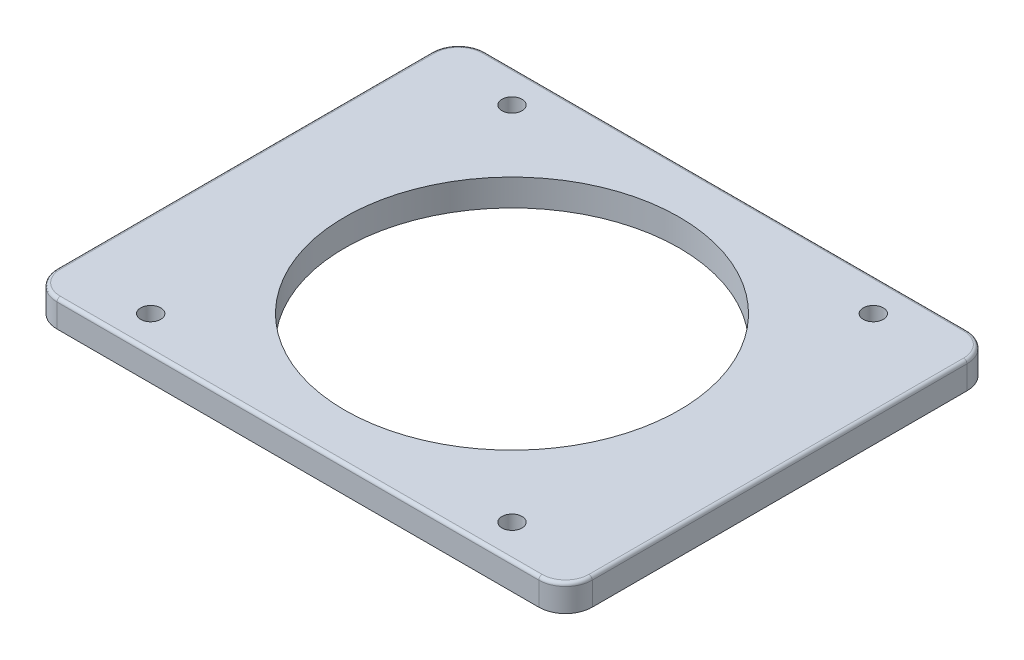
ISO-10303-21;
HEADER;
FILE_DESCRIPTION(('STEP AP214'),'2;1');
FILE_NAME('part.step','',(''),(''),'','','');
FILE_SCHEMA(('AUTOMOTIVE_DESIGN { 1 0 10303 214 1 1 1 1 }'));
ENDSEC;
DATA;
#1=APPLICATION_CONTEXT('core data for automotive mechanical design processes');
#2=APPLICATION_PROTOCOL_DEFINITION('international standard','automotive_design',2000,#1);
#3=PRODUCT_CONTEXT('',#1,'mechanical');
#4=PRODUCT('Part','Part','',(#3));
#5=PRODUCT_RELATED_PRODUCT_CATEGORY('part','',(#4));
#6=PRODUCT_DEFINITION_FORMATION('','',#4);
#7=PRODUCT_DEFINITION_CONTEXT('part definition',#1,'design');
#8=PRODUCT_DEFINITION('design','',#6,#7);
#9=PRODUCT_DEFINITION_SHAPE('','',#8);
#10=(LENGTH_UNIT() NAMED_UNIT(*) SI_UNIT(.MILLI.,.METRE.));
#11=(NAMED_UNIT(*) PLANE_ANGLE_UNIT() SI_UNIT($,.RADIAN.));
#12=(NAMED_UNIT(*) SI_UNIT($,.STERADIAN.) SOLID_ANGLE_UNIT());
#13=UNCERTAINTY_MEASURE_WITH_UNIT(LENGTH_MEASURE(1.E-05),#10,'distance_accuracy_value','');
#14=(GEOMETRIC_REPRESENTATION_CONTEXT(3) GLOBAL_UNCERTAINTY_ASSIGNED_CONTEXT((#13)) GLOBAL_UNIT_ASSIGNED_CONTEXT((#10,
#11,#12)) REPRESENTATION_CONTEXT('',''));
#15=CARTESIAN_POINT('',(0.,0.,0.));
#16=DIRECTION('',(0.,0.,1.));
#17=DIRECTION('',(1.,0.,0.));
#18=AXIS2_PLACEMENT_3D('',#15,#16,#17);
#19=CARTESIAN_POINT('',(0.,2.,0.));
#20=DIRECTION('',(0.,-1.,0.));
#21=DIRECTION('',(0.,0.,-1.));
#22=AXIS2_PLACEMENT_3D('',#19,#20,#21);
#23=PLANE('',#22);
#24=CARTESIAN_POINT('',(0.,2.,0.));
#25=DIRECTION('',(0.,1.,0.));
#26=DIRECTION('',(0.,0.,1.));
#27=AXIS2_PLACEMENT_3D('',#24,#25,#26);
#28=CIRCLE('',#27,12.5);
#29=CARTESIAN_POINT('',(0.,2.,12.5));
#30=VERTEX_POINT('',#29);
#31=EDGE_CURVE('E359',#30,#30,#28,.T.);
#32=ORIENTED_EDGE('',*,*,#31,.F.);
#33=EDGE_LOOP('',(#32));
#34=FACE_BOUND('',#33,.T.);
#35=CARTESIAN_POINT('',(-13.5,2.,-13.5));
#36=DIRECTION('',(0.,1.,0.));
#37=DIRECTION('',(0.,0.,1.));
#38=AXIS2_PLACEMENT_3D('',#35,#36,#37);
#39=CIRCLE('',#38,0.75);
#40=CARTESIAN_POINT('',(-13.5,2.,-12.75));
#41=VERTEX_POINT('',#40);
#42=EDGE_CURVE('E367',#41,#41,#39,.T.);
#43=ORIENTED_EDGE('',*,*,#42,.F.);
#44=EDGE_LOOP('',(#43));
#45=FACE_BOUND('',#44,.T.);
#46=CARTESIAN_POINT('',(13.5,2.,-13.5000000000008));
#47=DIRECTION('',(0.,1.,0.));
#48=DIRECTION('',(0.,0.,1.));
#49=AXIS2_PLACEMENT_3D('',#46,#47,#48);
#50=CIRCLE('',#49,0.750000000000775);
#51=CARTESIAN_POINT('',(13.5,2.,-12.75));
#52=VERTEX_POINT('',#51);
#53=EDGE_CURVE('E373',#52,#52,#50,.T.);
#54=ORIENTED_EDGE('',*,*,#53,.F.);
#55=EDGE_LOOP('',(#54));
#56=FACE_BOUND('',#55,.T.);
#57=CARTESIAN_POINT('',(13.5000000000007,2.,13.4999999999992));
#58=DIRECTION('',(0.,1.,0.));
#59=DIRECTION('',(0.,0.,1.));
#60=AXIS2_PLACEMENT_3D('',#57,#58,#59);
#61=CIRCLE('',#60,0.75000000000105);
#62=CARTESIAN_POINT('',(13.5000000000007,2.,14.2500000000003));
#63=VERTEX_POINT('',#62);
#64=EDGE_CURVE('E381',#63,#63,#61,.T.);
#65=ORIENTED_EDGE('',*,*,#64,.F.);
#66=EDGE_LOOP('',(#65));
#67=FACE_BOUND('',#66,.T.);
#68=CARTESIAN_POINT('',(-13.4999999999992,2.,13.5));
#69=DIRECTION('',(0.,1.,0.));
#70=DIRECTION('',(0.,0.,1.));
#71=AXIS2_PLACEMENT_3D('',#68,#69,#70);
#72=CIRCLE('',#71,0.750000000000388);
#73=CARTESIAN_POINT('',(-13.4999999999992,2.,14.2500000000004));
#74=VERTEX_POINT('',#73);
#75=EDGE_CURVE('E389',#74,#74,#72,.T.);
#76=ORIENTED_EDGE('',*,*,#75,.F.);
#77=EDGE_LOOP('',(#76));
#78=FACE_BOUND('',#77,.T.);
#79=CARTESIAN_POINT('',(18.,2.,14.));
#80=DIRECTION('',(0.,-1.,0.));
#81=DIRECTION('',(0.,0.,-1.));
#82=AXIS2_PLACEMENT_3D('',#79,#80,#81);
#83=CIRCLE('',#82,1.75);
#84=CARTESIAN_POINT('',(19.75,2.,14.));
#85=VERTEX_POINT('',#84);
#86=CARTESIAN_POINT('',(18.,2.,15.75));
#87=VERTEX_POINT('',#86);
#88=EDGE_CURVE('E176',#85,#87,#83,.T.);
#89=ORIENTED_EDGE('',*,*,#88,.F.);
#90=DIRECTION('',(0.,0.,-1.));
#91=VECTOR('',#90,1.);
#92=CARTESIAN_POINT('',(19.75,2.,0.));
#93=LINE('',#92,#91);
#94=CARTESIAN_POINT('',(19.75,2.,-14.));
#95=VERTEX_POINT('',#94);
#96=EDGE_CURVE('E288',#85,#95,#93,.T.);
#97=ORIENTED_EDGE('',*,*,#96,.T.);
#98=CARTESIAN_POINT('',(18.,2.,-14.));
#99=DIRECTION('',(0.,-1.,0.));
#100=DIRECTION('',(0.,0.,-1.));
#101=AXIS2_PLACEMENT_3D('',#98,#99,#100);
#102=CIRCLE('',#101,1.75);
#103=CARTESIAN_POINT('',(18.,2.,-15.75));
#104=VERTEX_POINT('',#103);
#105=EDGE_CURVE('E189',#104,#95,#102,.T.);
#106=ORIENTED_EDGE('',*,*,#105,.F.);
#107=DIRECTION('',(-1.,0.,0.));
#108=VECTOR('',#107,1.);
#109=CARTESIAN_POINT('',(0.,2.,-15.75));
#110=LINE('',#109,#108);
#111=CARTESIAN_POINT('',(-18.,2.,-15.75));
#112=VERTEX_POINT('',#111);
#113=EDGE_CURVE('E284',#104,#112,#110,.T.);
#114=ORIENTED_EDGE('',*,*,#113,.T.);
#115=CARTESIAN_POINT('',(-18.,2.,-14.));
#116=DIRECTION('',(0.,-1.,0.));
#117=DIRECTION('',(0.,0.,-1.));
#118=AXIS2_PLACEMENT_3D('',#115,#116,#117);
#119=CIRCLE('',#118,1.75);
#120=CARTESIAN_POINT('',(-19.75,2.,-14.));
#121=VERTEX_POINT('',#120);
#122=EDGE_CURVE('E178',#121,#112,#119,.T.);
#123=ORIENTED_EDGE('',*,*,#122,.F.);
#124=DIRECTION('',(0.,0.,1.));
#125=VECTOR('',#124,1.);
#126=CARTESIAN_POINT('',(-19.75,2.,0.));
#127=LINE('',#126,#125);
#128=CARTESIAN_POINT('',(-19.75,2.,14.));
#129=VERTEX_POINT('',#128);
#130=EDGE_CURVE('E280',#121,#129,#127,.T.);
#131=ORIENTED_EDGE('',*,*,#130,.T.);
#132=CARTESIAN_POINT('',(-18.,2.,14.));
#133=DIRECTION('',(0.,-1.,0.));
#134=DIRECTION('',(0.,0.,-1.));
#135=AXIS2_PLACEMENT_3D('',#132,#133,#134);
#136=CIRCLE('',#135,1.75);
#137=CARTESIAN_POINT('',(-18.,2.,15.75));
#138=VERTEX_POINT('',#137);
#139=EDGE_CURVE('E183',#138,#129,#136,.T.);
#140=ORIENTED_EDGE('',*,*,#139,.F.);
#141=DIRECTION('',(1.,0.,0.));
#142=VECTOR('',#141,1.);
#143=CARTESIAN_POINT('',(0.,2.,15.75));
#144=LINE('',#143,#142);
#145=EDGE_CURVE('E272',#138,#87,#144,.T.);
#146=ORIENTED_EDGE('',*,*,#145,.T.);
#147=EDGE_LOOP('',(#89,#97,#106,#114,#123,#131,#140,#146));
#148=FACE_BOUND('',#147,.T.);
#149=ADVANCED_FACE('F45',(#34,#45,#56,#67,#78,#148),#23,.F.);
#150=CARTESIAN_POINT('',(0.,0.,0.));
#151=DIRECTION('',(0.,-1.,0.));
#152=DIRECTION('',(0.,0.,-1.));
#153=AXIS2_PLACEMENT_3D('',#150,#151,#152);
#154=PLANE('',#153);
#155=CARTESIAN_POINT('',(13.5000000000007,0.,13.4999999999992));
#156=DIRECTION('',(0.,1.,0.));
#157=DIRECTION('',(0.,0.,1.));
#158=AXIS2_PLACEMENT_3D('',#155,#156,#157);
#159=CIRCLE('',#158,0.75000000000105);
#160=CARTESIAN_POINT('',(13.5000000000007,0.,14.2500000000003));
#161=VERTEX_POINT('',#160);
#162=EDGE_CURVE('E385',#161,#161,#159,.T.);
#163=ORIENTED_EDGE('',*,*,#162,.T.);
#164=EDGE_LOOP('',(#163));
#165=FACE_BOUND('',#164,.T.);
#166=CARTESIAN_POINT('',(-13.5,0.,-13.5));
#167=DIRECTION('',(0.,1.,0.));
#168=DIRECTION('',(0.,0.,1.));
#169=AXIS2_PLACEMENT_3D('',#166,#167,#168);
#170=CIRCLE('',#169,0.75);
#171=CARTESIAN_POINT('',(-13.5,0.,-12.75));
#172=VERTEX_POINT('',#171);
#173=EDGE_CURVE('E369',#172,#172,#170,.T.);
#174=ORIENTED_EDGE('',*,*,#173,.T.);
#175=EDGE_LOOP('',(#174));
#176=FACE_BOUND('',#175,.T.);
#177=DIRECTION('',(0.,0.,1.));
#178=VECTOR('',#177,1.);
#179=CARTESIAN_POINT('',(-20.,0.,16.));
#180=LINE('',#179,#178);
#181=CARTESIAN_POINT('',(-20.,0.,-14.));
#182=VERTEX_POINT('',#181);
#183=CARTESIAN_POINT('',(-20.,0.,14.));
#184=VERTEX_POINT('',#183);
#185=EDGE_CURVE('E261',#182,#184,#180,.T.);
#186=ORIENTED_EDGE('',*,*,#185,.F.);
#187=CARTESIAN_POINT('',(-18.,0.,-14.));
#188=DIRECTION('',(0.,-1.,0.));
#189=DIRECTION('',(0.,0.,-1.));
#190=AXIS2_PLACEMENT_3D('',#187,#188,#189);
#191=CIRCLE('',#190,2.);
#192=CARTESIAN_POINT('',(-18.,0.,-16.));
#193=VERTEX_POINT('',#192);
#194=EDGE_CURVE('E63',#182,#193,#191,.T.);
#195=ORIENTED_EDGE('',*,*,#194,.T.);
#196=DIRECTION('',(-1.,0.,0.));
#197=VECTOR('',#196,1.);
#198=CARTESIAN_POINT('',(-20.,0.,-16.));
#199=LINE('',#198,#197);
#200=CARTESIAN_POINT('',(18.,0.,-16.));
#201=VERTEX_POINT('',#200);
#202=EDGE_CURVE('E268',#201,#193,#199,.T.);
#203=ORIENTED_EDGE('',*,*,#202,.F.);
#204=CARTESIAN_POINT('',(18.,0.,-14.));
#205=DIRECTION('',(0.,-1.,0.));
#206=DIRECTION('',(0.,0.,-1.));
#207=AXIS2_PLACEMENT_3D('',#204,#205,#206);
#208=CIRCLE('',#207,2.);
#209=CARTESIAN_POINT('',(20.,0.,-14.));
#210=VERTEX_POINT('',#209);
#211=EDGE_CURVE('E223',#201,#210,#208,.T.);
#212=ORIENTED_EDGE('',*,*,#211,.T.);
#213=DIRECTION('',(0.,0.,-1.));
#214=VECTOR('',#213,1.);
#215=CARTESIAN_POINT('',(20.,0.,16.));
#216=LINE('',#215,#214);
#217=CARTESIAN_POINT('',(20.,0.,14.));
#218=VERTEX_POINT('',#217);
#219=EDGE_CURVE('E274',#218,#210,#216,.T.);
#220=ORIENTED_EDGE('',*,*,#219,.F.);
#221=CARTESIAN_POINT('',(18.,0.,14.));
#222=DIRECTION('',(0.,-1.,0.));
#223=DIRECTION('',(0.,0.,-1.));
#224=AXIS2_PLACEMENT_3D('',#221,#222,#223);
#225=CIRCLE('',#224,2.);
#226=CARTESIAN_POINT('',(18.,0.,16.));
#227=VERTEX_POINT('',#226);
#228=EDGE_CURVE('E220',#218,#227,#225,.T.);
#229=ORIENTED_EDGE('',*,*,#228,.T.);
#230=DIRECTION('',(1.,0.,0.));
#231=VECTOR('',#230,1.);
#232=CARTESIAN_POINT('',(-20.,0.,16.));
#233=LINE('',#232,#231);
#234=CARTESIAN_POINT('',(-18.,0.,16.));
#235=VERTEX_POINT('',#234);
#236=EDGE_CURVE('E145',#235,#227,#233,.T.);
#237=ORIENTED_EDGE('',*,*,#236,.F.);
#238=CARTESIAN_POINT('',(-18.,0.,14.));
#239=DIRECTION('',(0.,-1.,0.));
#240=DIRECTION('',(0.,0.,-1.));
#241=AXIS2_PLACEMENT_3D('',#238,#239,#240);
#242=CIRCLE('',#241,2.);
#243=EDGE_CURVE('E226',#235,#184,#242,.T.);
#244=ORIENTED_EDGE('',*,*,#243,.T.);
#245=EDGE_LOOP('',(#186,#195,#203,#212,#220,#229,#237,#244));
#246=FACE_BOUND('',#245,.T.);
#247=CARTESIAN_POINT('',(0.,0.,0.));
#248=DIRECTION('',(0.,1.,0.));
#249=DIRECTION('',(0.,0.,1.));
#250=AXIS2_PLACEMENT_3D('',#247,#248,#249);
#251=CIRCLE('',#250,12.5);
#252=CARTESIAN_POINT('',(0.,0.,12.5));
#253=VERTEX_POINT('',#252);
#254=EDGE_CURVE('E362',#253,#253,#251,.T.);
#255=ORIENTED_EDGE('',*,*,#254,.T.);
#256=EDGE_LOOP('',(#255));
#257=FACE_BOUND('',#256,.T.);
#258=CARTESIAN_POINT('',(13.5,0.,-13.5000000000008));
#259=DIRECTION('',(0.,1.,0.));
#260=DIRECTION('',(0.,0.,1.));
#261=AXIS2_PLACEMENT_3D('',#258,#259,#260);
#262=CIRCLE('',#261,0.750000000000775);
#263=CARTESIAN_POINT('',(13.5,0.,-12.75));
#264=VERTEX_POINT('',#263);
#265=EDGE_CURVE('E377',#264,#264,#262,.T.);
#266=ORIENTED_EDGE('',*,*,#265,.T.);
#267=EDGE_LOOP('',(#266));
#268=FACE_BOUND('',#267,.T.);
#269=CARTESIAN_POINT('',(-13.4999999999992,0.,13.5));
#270=DIRECTION('',(0.,1.,0.));
#271=DIRECTION('',(0.,0.,1.));
#272=AXIS2_PLACEMENT_3D('',#269,#270,#271);
#273=CIRCLE('',#272,0.750000000000388);
#274=CARTESIAN_POINT('',(-13.4999999999992,0.,14.2500000000004));
#275=VERTEX_POINT('',#274);
#276=EDGE_CURVE('E172',#275,#275,#273,.T.);
#277=ORIENTED_EDGE('',*,*,#276,.T.);
#278=EDGE_LOOP('',(#277));
#279=FACE_BOUND('',#278,.T.);
#280=ADVANCED_FACE('F264',(#165,#176,#246,#257,#268,#279),#154,.T.);
#281=CARTESIAN_POINT('',(20.,2.,16.));
#282=DIRECTION('',(-1.,0.,0.));
#283=DIRECTION('',(0.,0.,1.));
#284=AXIS2_PLACEMENT_3D('',#281,#282,#283);
#285=PLANE('',#284);
#286=ORIENTED_EDGE('',*,*,#219,.T.);
#287=DIRECTION('',(0.,-1.,0.));
#288=VECTOR('',#287,1.);
#289=CARTESIAN_POINT('',(20.,2.,-14.));
#290=LINE('',#289,#288);
#291=CARTESIAN_POINT('',(20.,1.75,-14.));
#292=VERTEX_POINT('',#291);
#293=EDGE_CURVE('E11',#210,#292,#290,.F.);
#294=ORIENTED_EDGE('',*,*,#293,.T.);
#295=DIRECTION('',(0.,0.,-1.));
#296=VECTOR('',#295,1.);
#297=CARTESIAN_POINT('',(20.,1.75,16.));
#298=LINE('',#297,#296);
#299=CARTESIAN_POINT('',(20.,1.75,14.));
#300=VERTEX_POINT('',#299);
#301=EDGE_CURVE('E292',#292,#300,#298,.F.);
#302=ORIENTED_EDGE('',*,*,#301,.T.);
#303=DIRECTION('',(0.,-1.,0.));
#304=VECTOR('',#303,1.);
#305=CARTESIAN_POINT('',(20.,2.,14.));
#306=LINE('',#305,#304);
#307=EDGE_CURVE('E55',#300,#218,#306,.T.);
#308=ORIENTED_EDGE('',*,*,#307,.T.);
#309=EDGE_LOOP('',(#286,#294,#302,#308));
#310=FACE_BOUND('',#309,.T.);
#311=ADVANCED_FACE('F337',(#310),#285,.F.);
#312=CARTESIAN_POINT('',(-20.,2.,-16.));
#313=DIRECTION('',(0.,0.,1.));
#314=DIRECTION('',(1.,0.,0.));
#315=AXIS2_PLACEMENT_3D('',#312,#313,#314);
#316=PLANE('',#315);
#317=ORIENTED_EDGE('',*,*,#202,.T.);
#318=DIRECTION('',(0.,-1.,0.));
#319=VECTOR('',#318,1.);
#320=CARTESIAN_POINT('',(-18.,2.,-16.));
#321=LINE('',#320,#319);
#322=CARTESIAN_POINT('',(-18.,1.75,-16.));
#323=VERTEX_POINT('',#322);
#324=EDGE_CURVE('E151',#193,#323,#321,.F.);
#325=ORIENTED_EDGE('',*,*,#324,.T.);
#326=DIRECTION('',(-1.,0.,0.));
#327=VECTOR('',#326,1.);
#328=CARTESIAN_POINT('',(-20.,1.75,-16.));
#329=LINE('',#328,#327);
#330=CARTESIAN_POINT('',(18.,1.75,-16.));
#331=VERTEX_POINT('',#330);
#332=EDGE_CURVE('E296',#323,#331,#329,.F.);
#333=ORIENTED_EDGE('',*,*,#332,.T.);
#334=DIRECTION('',(0.,-1.,0.));
#335=VECTOR('',#334,1.);
#336=CARTESIAN_POINT('',(18.,2.,-16.));
#337=LINE('',#336,#335);
#338=EDGE_CURVE('E70',#331,#201,#337,.T.);
#339=ORIENTED_EDGE('',*,*,#338,.T.);
#340=EDGE_LOOP('',(#317,#325,#333,#339));
#341=FACE_BOUND('',#340,.T.);
#342=ADVANCED_FACE('F301',(#341),#316,.F.);
#343=CARTESIAN_POINT('',(-20.,2.,16.));
#344=DIRECTION('',(1.,0.,0.));
#345=DIRECTION('',(0.,0.,-1.));
#346=AXIS2_PLACEMENT_3D('',#343,#344,#345);
#347=PLANE('',#346);
#348=DIRECTION('',(0.,0.,1.));
#349=VECTOR('',#348,1.);
#350=CARTESIAN_POINT('',(-20.,1.75,16.));
#351=LINE('',#350,#349);
#352=CARTESIAN_POINT('',(-20.,1.75,14.));
#353=VERTEX_POINT('',#352);
#354=CARTESIAN_POINT('',(-20.,1.75,-14.));
#355=VERTEX_POINT('',#354);
#356=EDGE_CURVE('E163',#353,#355,#351,.F.);
#357=ORIENTED_EDGE('',*,*,#356,.T.);
#358=DIRECTION('',(0.,-1.,0.));
#359=VECTOR('',#358,1.);
#360=CARTESIAN_POINT('',(-20.,2.,-14.));
#361=LINE('',#360,#359);
#362=EDGE_CURVE('E217',#355,#182,#361,.T.);
#363=ORIENTED_EDGE('',*,*,#362,.T.);
#364=ORIENTED_EDGE('',*,*,#185,.T.);
#365=DIRECTION('',(0.,-1.,0.));
#366=VECTOR('',#365,1.);
#367=CARTESIAN_POINT('',(-20.,2.,14.));
#368=LINE('',#367,#366);
#369=EDGE_CURVE('E214',#184,#353,#368,.F.);
#370=ORIENTED_EDGE('',*,*,#369,.T.);
#371=EDGE_LOOP('',(#357,#363,#364,#370));
#372=FACE_BOUND('',#371,.T.);
#373=ADVANCED_FACE('F260',(#372),#347,.F.);
#374=CARTESIAN_POINT('',(-20.,2.,16.));
#375=DIRECTION('',(0.,0.,-1.));
#376=DIRECTION('',(-1.,0.,0.));
#377=AXIS2_PLACEMENT_3D('',#374,#375,#376);
#378=PLANE('',#377);
#379=DIRECTION('',(1.,0.,0.));
#380=VECTOR('',#379,1.);
#381=CARTESIAN_POINT('',(-20.,1.75,16.));
#382=LINE('',#381,#380);
#383=CARTESIAN_POINT('',(18.,1.75,16.));
#384=VERTEX_POINT('',#383);
#385=CARTESIAN_POINT('',(-18.,1.75,16.));
#386=VERTEX_POINT('',#385);
#387=EDGE_CURVE('E142',#384,#386,#382,.F.);
#388=ORIENTED_EDGE('',*,*,#387,.T.);
#389=DIRECTION('',(0.,-1.,0.));
#390=VECTOR('',#389,1.);
#391=CARTESIAN_POINT('',(-18.,2.,16.));
#392=LINE('',#391,#390);
#393=EDGE_CURVE('E150',#386,#235,#392,.T.);
#394=ORIENTED_EDGE('',*,*,#393,.T.);
#395=ORIENTED_EDGE('',*,*,#236,.T.);
#396=DIRECTION('',(0.,-1.,0.));
#397=VECTOR('',#396,1.);
#398=CARTESIAN_POINT('',(18.,2.,16.));
#399=LINE('',#398,#397);
#400=EDGE_CURVE('E139',#227,#384,#399,.F.);
#401=ORIENTED_EDGE('',*,*,#400,.T.);
#402=EDGE_LOOP('',(#388,#394,#395,#401));
#403=FACE_BOUND('',#402,.T.);
#404=ADVANCED_FACE('F141',(#403),#378,.F.);
#405=CARTESIAN_POINT('',(0.,2.,0.));
#406=DIRECTION('',(0.,-1.,0.));
#407=DIRECTION('',(0.,0.,-1.));
#408=AXIS2_PLACEMENT_3D('',#405,#406,#407);
#409=CYLINDRICAL_SURFACE('',#408,12.5);
#410=ORIENTED_EDGE('',*,*,#31,.T.);
#411=EDGE_LOOP('',(#410));
#412=FACE_BOUND('',#411,.T.);
#413=ORIENTED_EDGE('',*,*,#254,.F.);
#414=EDGE_LOOP('',(#413));
#415=FACE_BOUND('',#414,.T.);
#416=ADVANCED_FACE('F343',(#412,#415),#409,.F.);
#417=CARTESIAN_POINT('',(-13.5,2.,-13.5));
#418=DIRECTION('',(0.,-1.,0.));
#419=DIRECTION('',(0.,0.,-1.));
#420=AXIS2_PLACEMENT_3D('',#417,#418,#419);
#421=CYLINDRICAL_SURFACE('',#420,0.75);
#422=ORIENTED_EDGE('',*,*,#42,.T.);
#423=EDGE_LOOP('',(#422));
#424=FACE_BOUND('',#423,.T.);
#425=ORIENTED_EDGE('',*,*,#173,.F.);
#426=EDGE_LOOP('',(#425));
#427=FACE_BOUND('',#426,.T.);
#428=ADVANCED_FACE('F418',(#424,#427),#421,.F.);
#429=CARTESIAN_POINT('',(13.5,2.,-13.5000000000008));
#430=DIRECTION('',(0.,-1.,0.));
#431=DIRECTION('',(0.,0.,-1.));
#432=AXIS2_PLACEMENT_3D('',#429,#430,#431);
#433=CYLINDRICAL_SURFACE('',#432,0.750000000000775);
#434=ORIENTED_EDGE('',*,*,#53,.T.);
#435=EDGE_LOOP('',(#434));
#436=FACE_BOUND('',#435,.T.);
#437=ORIENTED_EDGE('',*,*,#265,.F.);
#438=EDGE_LOOP('',(#437));
#439=FACE_BOUND('',#438,.T.);
#440=ADVANCED_FACE('F413',(#436,#439),#433,.F.);
#441=CARTESIAN_POINT('',(13.5000000000007,2.,13.4999999999992));
#442=DIRECTION('',(0.,-1.,0.));
#443=DIRECTION('',(0.,0.,-1.));
#444=AXIS2_PLACEMENT_3D('',#441,#442,#443);
#445=CYLINDRICAL_SURFACE('',#444,0.75000000000105);
#446=ORIENTED_EDGE('',*,*,#64,.T.);
#447=EDGE_LOOP('',(#446));
#448=FACE_BOUND('',#447,.T.);
#449=ORIENTED_EDGE('',*,*,#162,.F.);
#450=EDGE_LOOP('',(#449));
#451=FACE_BOUND('',#450,.T.);
#452=ADVANCED_FACE('F404',(#448,#451),#445,.F.);
#453=CARTESIAN_POINT('',(-13.4999999999992,2.,13.5));
#454=DIRECTION('',(0.,-1.,0.));
#455=DIRECTION('',(0.,0.,-1.));
#456=AXIS2_PLACEMENT_3D('',#453,#454,#455);
#457=CYLINDRICAL_SURFACE('',#456,0.750000000000388);
#458=ORIENTED_EDGE('',*,*,#75,.T.);
#459=EDGE_LOOP('',(#458));
#460=FACE_BOUND('',#459,.T.);
#461=ORIENTED_EDGE('',*,*,#276,.F.);
#462=EDGE_LOOP('',(#461));
#463=FACE_BOUND('',#462,.T.);
#464=ADVANCED_FACE('F400',(#460,#463),#457,.F.);
#465=CARTESIAN_POINT('',(-19.75,1.75,0.));
#466=DIRECTION('',(0.,0.,1.));
#467=DIRECTION('',(1.,0.,0.));
#468=AXIS2_PLACEMENT_3D('',#465,#466,#467);
#469=CYLINDRICAL_SURFACE('',#468,0.25);
#470=ORIENTED_EDGE('',*,*,#356,.F.);
#471=CARTESIAN_POINT('',(-19.75,1.75,14.));
#472=DIRECTION('',(0.,0.,-1.));
#473=DIRECTION('',(-1.,0.,0.));
#474=AXIS2_PLACEMENT_3D('',#471,#472,#473);
#475=CIRCLE('',#474,0.25);
#476=EDGE_CURVE('E204',#353,#129,#475,.T.);
#477=ORIENTED_EDGE('',*,*,#476,.T.);
#478=ORIENTED_EDGE('',*,*,#130,.F.);
#479=CARTESIAN_POINT('',(-19.75,1.75,-14.));
#480=DIRECTION('',(0.,0.,1.));
#481=DIRECTION('',(1.,0.,0.));
#482=AXIS2_PLACEMENT_3D('',#479,#480,#481);
#483=CIRCLE('',#482,0.25);
#484=EDGE_CURVE('E201',#121,#355,#483,.T.);
#485=ORIENTED_EDGE('',*,*,#484,.T.);
#486=EDGE_LOOP('',(#470,#477,#478,#485));
#487=FACE_BOUND('',#486,.T.);
#488=ADVANCED_FACE('F321',(#487),#469,.T.);
#489=CARTESIAN_POINT('',(0.,1.75,15.75));
#490=DIRECTION('',(1.,0.,0.));
#491=DIRECTION('',(0.,0.,-1.));
#492=AXIS2_PLACEMENT_3D('',#489,#490,#491);
#493=CYLINDRICAL_SURFACE('',#492,0.25);
#494=ORIENTED_EDGE('',*,*,#387,.F.);
#495=CARTESIAN_POINT('',(18.,1.75,15.75));
#496=DIRECTION('',(-1.,0.,0.));
#497=DIRECTION('',(0.,0.,1.));
#498=AXIS2_PLACEMENT_3D('',#495,#496,#497);
#499=CIRCLE('',#498,0.25);
#500=EDGE_CURVE('E158',#384,#87,#499,.T.);
#501=ORIENTED_EDGE('',*,*,#500,.T.);
#502=ORIENTED_EDGE('',*,*,#145,.F.);
#503=CARTESIAN_POINT('',(-18.,1.75,15.75));
#504=DIRECTION('',(1.,0.,0.));
#505=DIRECTION('',(0.,0.,-1.));
#506=AXIS2_PLACEMENT_3D('',#503,#504,#505);
#507=CIRCLE('',#506,0.25);
#508=EDGE_CURVE('E161',#138,#386,#507,.T.);
#509=ORIENTED_EDGE('',*,*,#508,.T.);
#510=EDGE_LOOP('',(#494,#501,#502,#509));
#511=FACE_BOUND('',#510,.T.);
#512=ADVANCED_FACE('F155',(#511),#493,.T.);
#513=CARTESIAN_POINT('',(0.,1.75,-15.75));
#514=DIRECTION('',(-1.,0.,0.));
#515=DIRECTION('',(0.,0.,1.));
#516=AXIS2_PLACEMENT_3D('',#513,#514,#515);
#517=CYLINDRICAL_SURFACE('',#516,0.25);
#518=ORIENTED_EDGE('',*,*,#332,.F.);
#519=CARTESIAN_POINT('',(-18.,1.75,-15.75));
#520=DIRECTION('',(1.,0.,0.));
#521=DIRECTION('',(0.,0.,-1.));
#522=AXIS2_PLACEMENT_3D('',#519,#520,#521);
#523=CIRCLE('',#522,0.25);
#524=EDGE_CURVE('E211',#323,#112,#523,.T.);
#525=ORIENTED_EDGE('',*,*,#524,.T.);
#526=ORIENTED_EDGE('',*,*,#113,.F.);
#527=CARTESIAN_POINT('',(18.,1.75,-15.75));
#528=DIRECTION('',(-1.,0.,0.));
#529=DIRECTION('',(0.,0.,1.));
#530=AXIS2_PLACEMENT_3D('',#527,#528,#529);
#531=CIRCLE('',#530,0.25);
#532=EDGE_CURVE('E208',#104,#331,#531,.T.);
#533=ORIENTED_EDGE('',*,*,#532,.T.);
#534=EDGE_LOOP('',(#518,#525,#526,#533));
#535=FACE_BOUND('',#534,.T.);
#536=ADVANCED_FACE('F322',(#535),#517,.T.);
#537=CARTESIAN_POINT('',(19.75,1.75,0.));
#538=DIRECTION('',(0.,0.,-1.));
#539=DIRECTION('',(-1.,0.,0.));
#540=AXIS2_PLACEMENT_3D('',#537,#538,#539);
#541=CYLINDRICAL_SURFACE('',#540,0.25);
#542=ORIENTED_EDGE('',*,*,#301,.F.);
#543=CARTESIAN_POINT('',(19.75,1.75,-14.));
#544=DIRECTION('',(0.,0.,1.));
#545=DIRECTION('',(1.,0.,0.));
#546=AXIS2_PLACEMENT_3D('',#543,#544,#545);
#547=CIRCLE('',#546,0.25);
#548=EDGE_CURVE('E198',#292,#95,#547,.T.);
#549=ORIENTED_EDGE('',*,*,#548,.T.);
#550=ORIENTED_EDGE('',*,*,#96,.F.);
#551=CARTESIAN_POINT('',(19.75,1.75,14.));
#552=DIRECTION('',(0.,0.,-1.));
#553=DIRECTION('',(-1.,0.,0.));
#554=AXIS2_PLACEMENT_3D('',#551,#552,#553);
#555=CIRCLE('',#554,0.25);
#556=EDGE_CURVE('E195',#85,#300,#555,.T.);
#557=ORIENTED_EDGE('',*,*,#556,.T.);
#558=EDGE_LOOP('',(#542,#549,#550,#557));
#559=FACE_BOUND('',#558,.T.);
#560=ADVANCED_FACE('F315',(#559),#541,.T.);
#561=CARTESIAN_POINT('',(18.,2.,14.));
#562=DIRECTION('',(0.,-1.,0.));
#563=DIRECTION('',(0.,0.,-1.));
#564=AXIS2_PLACEMENT_3D('',#561,#562,#563);
#565=CYLINDRICAL_SURFACE('',#564,2.);
#566=ORIENTED_EDGE('',*,*,#228,.F.);
#567=ORIENTED_EDGE('',*,*,#307,.F.);
#568=CARTESIAN_POINT('',(18.,1.75,14.));
#569=DIRECTION('',(0.,-1.,0.));
#570=DIRECTION('',(0.,0.,-1.));
#571=AXIS2_PLACEMENT_3D('',#568,#569,#570);
#572=CIRCLE('',#571,2.);
#573=EDGE_CURVE('E167',#384,#300,#572,.F.);
#574=ORIENTED_EDGE('',*,*,#573,.F.);
#575=ORIENTED_EDGE('',*,*,#400,.F.);
#576=EDGE_LOOP('',(#566,#567,#574,#575));
#577=FACE_BOUND('',#576,.T.);
#578=ADVANCED_FACE('F168',(#577),#565,.T.);
#579=CARTESIAN_POINT('',(18.,1.75,14.));
#580=DIRECTION('',(0.,-1.,0.));
#581=DIRECTION('',(0.,0.,-1.));
#582=AXIS2_PLACEMENT_3D('',#579,#580,#581);
#583=TOROIDAL_SURFACE('',#582,1.75,0.25);
#584=ORIENTED_EDGE('',*,*,#500,.F.);
#585=ORIENTED_EDGE('',*,*,#573,.T.);
#586=ORIENTED_EDGE('',*,*,#556,.F.);
#587=ORIENTED_EDGE('',*,*,#88,.T.);
#588=EDGE_LOOP('',(#584,#585,#586,#587));
#589=FACE_BOUND('',#588,.T.);
#590=ADVANCED_FACE('F175',(#589),#583,.T.);
#591=CARTESIAN_POINT('',(18.,2.,-14.));
#592=DIRECTION('',(0.,-1.,0.));
#593=DIRECTION('',(0.,0.,-1.));
#594=AXIS2_PLACEMENT_3D('',#591,#592,#593);
#595=CYLINDRICAL_SURFACE('',#594,2.);
#596=ORIENTED_EDGE('',*,*,#211,.F.);
#597=ORIENTED_EDGE('',*,*,#338,.F.);
#598=CARTESIAN_POINT('',(18.,1.75,-14.));
#599=DIRECTION('',(0.,-1.,0.));
#600=DIRECTION('',(0.,0.,-1.));
#601=AXIS2_PLACEMENT_3D('',#598,#599,#600);
#602=CIRCLE('',#601,2.);
#603=EDGE_CURVE('E173',#292,#331,#602,.F.);
#604=ORIENTED_EDGE('',*,*,#603,.F.);
#605=ORIENTED_EDGE('',*,*,#293,.F.);
#606=EDGE_LOOP('',(#596,#597,#604,#605));
#607=FACE_BOUND('',#606,.T.);
#608=ADVANCED_FACE('F306',(#607),#595,.T.);
#609=CARTESIAN_POINT('',(18.,1.75,-14.));
#610=DIRECTION('',(0.,-1.,0.));
#611=DIRECTION('',(0.,0.,-1.));
#612=AXIS2_PLACEMENT_3D('',#609,#610,#611);
#613=TOROIDAL_SURFACE('',#612,1.75,0.25);
#614=ORIENTED_EDGE('',*,*,#532,.F.);
#615=ORIENTED_EDGE('',*,*,#105,.T.);
#616=ORIENTED_EDGE('',*,*,#548,.F.);
#617=ORIENTED_EDGE('',*,*,#603,.T.);
#618=EDGE_LOOP('',(#614,#615,#616,#617));
#619=FACE_BOUND('',#618,.T.);
#620=ADVANCED_FACE('F310',(#619),#613,.T.);
#621=CARTESIAN_POINT('',(-18.,2.,14.));
#622=DIRECTION('',(0.,-1.,0.));
#623=DIRECTION('',(0.,0.,-1.));
#624=AXIS2_PLACEMENT_3D('',#621,#622,#623);
#625=CYLINDRICAL_SURFACE('',#624,2.);
#626=ORIENTED_EDGE('',*,*,#243,.F.);
#627=ORIENTED_EDGE('',*,*,#393,.F.);
#628=CARTESIAN_POINT('',(-18.,1.75,14.));
#629=DIRECTION('',(0.,-1.,0.));
#630=DIRECTION('',(0.,0.,-1.));
#631=AXIS2_PLACEMENT_3D('',#628,#629,#630);
#632=CIRCLE('',#631,2.);
#633=EDGE_CURVE('E241',#353,#386,#632,.F.);
#634=ORIENTED_EDGE('',*,*,#633,.F.);
#635=ORIENTED_EDGE('',*,*,#369,.F.);
#636=EDGE_LOOP('',(#626,#627,#634,#635));
#637=FACE_BOUND('',#636,.T.);
#638=ADVANCED_FACE('F576',(#637),#625,.T.);
#639=CARTESIAN_POINT('',(-18.,1.75,14.));
#640=DIRECTION('',(0.,-1.,0.));
#641=DIRECTION('',(0.,0.,-1.));
#642=AXIS2_PLACEMENT_3D('',#639,#640,#641);
#643=TOROIDAL_SURFACE('',#642,1.75,0.25);
#644=ORIENTED_EDGE('',*,*,#476,.F.);
#645=ORIENTED_EDGE('',*,*,#633,.T.);
#646=ORIENTED_EDGE('',*,*,#508,.F.);
#647=ORIENTED_EDGE('',*,*,#139,.T.);
#648=EDGE_LOOP('',(#644,#645,#646,#647));
#649=FACE_BOUND('',#648,.T.);
#650=ADVANCED_FACE('F318',(#649),#643,.T.);
#651=CARTESIAN_POINT('',(-18.,2.,-14.));
#652=DIRECTION('',(0.,-1.,0.));
#653=DIRECTION('',(0.,0.,-1.));
#654=AXIS2_PLACEMENT_3D('',#651,#652,#653);
#655=CYLINDRICAL_SURFACE('',#654,2.);
#656=ORIENTED_EDGE('',*,*,#194,.F.);
#657=ORIENTED_EDGE('',*,*,#362,.F.);
#658=CARTESIAN_POINT('',(-18.,1.75,-14.));
#659=DIRECTION('',(0.,-1.,0.));
#660=DIRECTION('',(0.,0.,-1.));
#661=AXIS2_PLACEMENT_3D('',#658,#659,#660);
#662=CIRCLE('',#661,2.);
#663=EDGE_CURVE('E49',#323,#355,#662,.F.);
#664=ORIENTED_EDGE('',*,*,#663,.F.);
#665=ORIENTED_EDGE('',*,*,#324,.F.);
#666=EDGE_LOOP('',(#656,#657,#664,#665));
#667=FACE_BOUND('',#666,.T.);
#668=ADVANCED_FACE('F47',(#667),#655,.T.);
#669=CARTESIAN_POINT('',(-18.,1.75,-14.));
#670=DIRECTION('',(0.,-1.,0.));
#671=DIRECTION('',(0.,0.,-1.));
#672=AXIS2_PLACEMENT_3D('',#669,#670,#671);
#673=TOROIDAL_SURFACE('',#672,1.75,0.25);
#674=ORIENTED_EDGE('',*,*,#484,.F.);
#675=ORIENTED_EDGE('',*,*,#122,.T.);
#676=ORIENTED_EDGE('',*,*,#524,.F.);
#677=ORIENTED_EDGE('',*,*,#663,.T.);
#678=EDGE_LOOP('',(#674,#675,#676,#677));
#679=FACE_BOUND('',#678,.T.);
#680=ADVANCED_FACE('F252',(#679),#673,.T.);
#681=CLOSED_SHELL('',(#149,#280,#311,#342,#373,#404,#416,#428,#440,#452,#464,#488,#512,#536,
#560,#578,#590,#608,#620,#638,#650,#668,#680));
#682=MANIFOLD_SOLID_BREP('B2',#681);
#683=ADVANCED_BREP_SHAPE_REPRESENTATION('',(#18,#682),#14);
#684=SHAPE_DEFINITION_REPRESENTATION(#9,#683);
ENDSEC;
END-ISO-10303-21;
